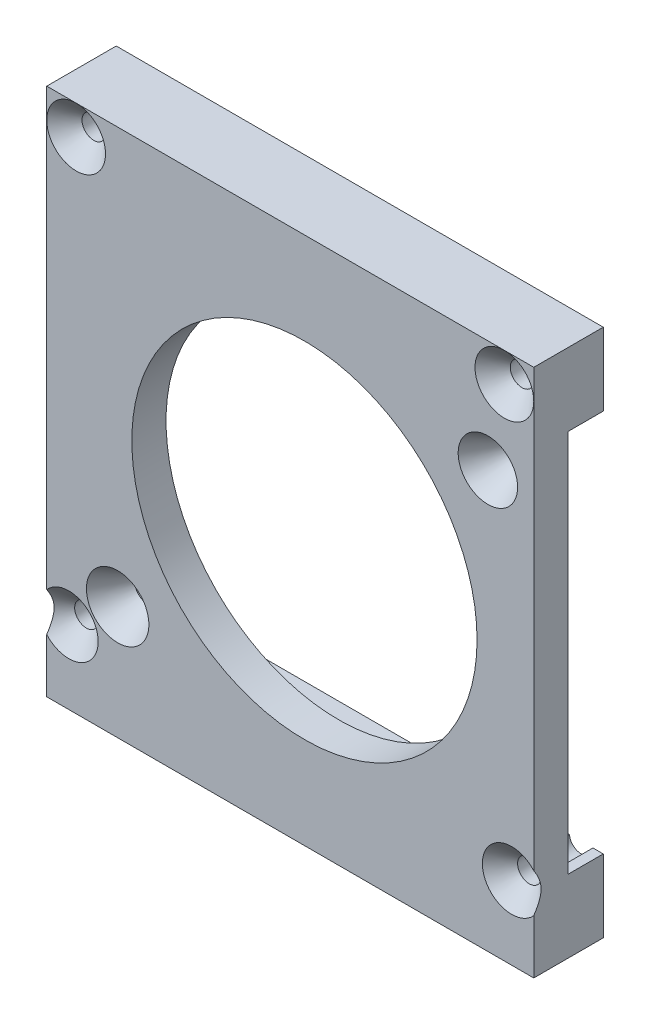
ISO-10303-21;
HEADER;
FILE_DESCRIPTION(('STEP AP214'),'2;1');
FILE_NAME('part.step','',(''),(''),'','','');
FILE_SCHEMA(('AUTOMOTIVE_DESIGN { 1 0 10303 214 1 1 1 1 }'));
ENDSEC;
DATA;
#1=APPLICATION_CONTEXT('core data for automotive mechanical design processes');
#2=APPLICATION_PROTOCOL_DEFINITION('international standard','automotive_design',2000,#1);
#3=PRODUCT_CONTEXT('',#1,'mechanical');
#4=PRODUCT('Part','Part','',(#3));
#5=PRODUCT_RELATED_PRODUCT_CATEGORY('part','',(#4));
#6=PRODUCT_DEFINITION_FORMATION('','',#4);
#7=PRODUCT_DEFINITION_CONTEXT('part definition',#1,'design');
#8=PRODUCT_DEFINITION('design','',#6,#7);
#9=PRODUCT_DEFINITION_SHAPE('','',#8);
#10=(LENGTH_UNIT() NAMED_UNIT(*) SI_UNIT(.MILLI.,.METRE.));
#11=(NAMED_UNIT(*) PLANE_ANGLE_UNIT() SI_UNIT($,.RADIAN.));
#12=(NAMED_UNIT(*) SI_UNIT($,.STERADIAN.) SOLID_ANGLE_UNIT());
#13=UNCERTAINTY_MEASURE_WITH_UNIT(LENGTH_MEASURE(1.E-05),#10,'distance_accuracy_value','');
#14=(GEOMETRIC_REPRESENTATION_CONTEXT(3) GLOBAL_UNCERTAINTY_ASSIGNED_CONTEXT((#13)) GLOBAL_UNIT_ASSIGNED_CONTEXT((#10,
#11,#12)) REPRESENTATION_CONTEXT('',''));
#15=CARTESIAN_POINT('',(0.,0.,0.));
#16=DIRECTION('',(0.,0.,1.));
#17=DIRECTION('',(1.,0.,0.));
#18=AXIS2_PLACEMENT_3D('',#15,#16,#17);
#19=CARTESIAN_POINT('',(0.,0.,4.73));
#20=DIRECTION('',(0.,0.,1.));
#21=DIRECTION('',(1.,0.,0.));
#22=AXIS2_PLACEMENT_3D('',#19,#20,#21);
#23=PLANE('',#22);
#24=DIRECTION('',(-1.,0.,0.));
#25=VECTOR('',#24,1.);
#26=CARTESIAN_POINT('',(0.,18.,4.73));
#27=LINE('',#26,#25);
#28=CARTESIAN_POINT('',(16.575,18.,4.73));
#29=VERTEX_POINT('',#28);
#30=CARTESIAN_POINT('',(14.575,18.,4.73));
#31=VERTEX_POINT('',#30);
#32=EDGE_CURVE('E355',#29,#31,#27,.T.);
#33=ORIENTED_EDGE('',*,*,#32,.T.);
#34=CARTESIAN_POINT('',(14.575,16.,4.73));
#35=DIRECTION('',(0.,0.,1.));
#36=DIRECTION('',(1.,0.,0.));
#37=AXIS2_PLACEMENT_3D('',#34,#35,#36);
#38=CIRCLE('',#37,1.99999999999999);
#39=CARTESIAN_POINT('',(16.575,16.,4.73));
#40=VERTEX_POINT('',#39);
#41=EDGE_CURVE('E242',#31,#40,#38,.F.);
#42=ORIENTED_EDGE('',*,*,#41,.T.);
#43=DIRECTION('',(0.,-1.,0.));
#44=VECTOR('',#43,1.);
#45=CARTESIAN_POINT('',(16.575,0.,4.73));
#46=LINE('',#45,#44);
#47=EDGE_CURVE('E344',#29,#40,#46,.T.);
#48=ORIENTED_EDGE('',*,*,#47,.F.);
#49=EDGE_LOOP('',(#33,#42,#48));
#50=FACE_BOUND('',#49,.T.);
#51=ADVANCED_FACE('F37',(#50),#23,.T.);
#52=DIRECTION('',(0.,-1.,0.));
#53=VECTOR('',#52,1.);
#54=CARTESIAN_POINT('',(-16.575,0.,4.73));
#55=LINE('',#54,#53);
#56=CARTESIAN_POINT('',(-16.575,18.,4.73));
#57=VERTEX_POINT('',#56);
#58=CARTESIAN_POINT('',(-16.575,16.,4.73));
#59=VERTEX_POINT('',#58);
#60=EDGE_CURVE('E326',#57,#59,#55,.T.);
#61=ORIENTED_EDGE('',*,*,#60,.T.);
#62=CARTESIAN_POINT('',(-14.575,16.,4.73));
#63=DIRECTION('',(0.,0.,1.));
#64=DIRECTION('',(1.,0.,0.));
#65=AXIS2_PLACEMENT_3D('',#62,#63,#64);
#66=CIRCLE('',#65,1.99999999999999);
#67=CARTESIAN_POINT('',(-14.575,18.,4.73));
#68=VERTEX_POINT('',#67);
#69=EDGE_CURVE('E237',#59,#68,#66,.F.);
#70=ORIENTED_EDGE('',*,*,#69,.T.);
#71=EDGE_CURVE('E352',#68,#57,#27,.T.);
#72=ORIENTED_EDGE('',*,*,#71,.T.);
#73=EDGE_LOOP('',(#61,#70,#72));
#74=FACE_BOUND('',#73,.T.);
#75=ADVANCED_FACE('F297',(#74),#23,.T.);
#76=CARTESIAN_POINT('',(-14.975,-13.05,2.4));
#77=DIRECTION('',(0.,-1.,0.));
#78=DIRECTION('',(0.,0.,-1.));
#79=AXIS2_PLACEMENT_3D('',#76,#77,#78);
#80=PLANE('',#79);
#81=DIRECTION('',(-1.,0.,0.));
#82=VECTOR('',#81,1.);
#83=CARTESIAN_POINT('',(-14.975,-13.05,0.));
#84=LINE('',#83,#82);
#85=CARTESIAN_POINT('',(16.575,-13.05,0.));
#86=VERTEX_POINT('',#85);
#87=CARTESIAN_POINT('',(15.8734359711336,-13.05,0.));
#88=VERTEX_POINT('',#87);
#89=EDGE_CURVE('E165',#86,#88,#84,.T.);
#90=ORIENTED_EDGE('',*,*,#89,.T.);
#91=DIRECTION('',(0.,0.,1.));
#92=VECTOR('',#91,1.);
#93=CARTESIAN_POINT('',(15.8734359711336,-13.05,-1.07));
#94=LINE('',#93,#92);
#95=CARTESIAN_POINT('',(15.8734359711336,-13.05,2.4));
#96=VERTEX_POINT('',#95);
#97=EDGE_CURVE('E147',#88,#96,#94,.T.);
#98=ORIENTED_EDGE('',*,*,#97,.T.);
#99=DIRECTION('',(-1.,0.,0.));
#100=VECTOR('',#99,1.);
#101=CARTESIAN_POINT('',(-14.975,-13.05,2.4));
#102=LINE('',#101,#100);
#103=CARTESIAN_POINT('',(16.575,-13.05,2.4));
#104=VERTEX_POINT('',#103);
#105=EDGE_CURVE('E162',#104,#96,#102,.T.);
#106=ORIENTED_EDGE('',*,*,#105,.F.);
#107=DIRECTION('',(0.,0.,-1.));
#108=VECTOR('',#107,1.);
#109=CARTESIAN_POINT('',(16.575,-13.05,2.4));
#110=LINE('',#109,#108);
#111=EDGE_CURVE('E206',#104,#86,#110,.T.);
#112=ORIENTED_EDGE('',*,*,#111,.T.);
#113=EDGE_LOOP('',(#90,#98,#106,#112));
#114=FACE_BOUND('',#113,.T.);
#115=ADVANCED_FACE('F160',(#114),#80,.F.);
#116=CARTESIAN_POINT('',(-16.575,18.,2.4));
#117=DIRECTION('',(0.,-1.,0.));
#118=DIRECTION('',(0.,0.,-1.));
#119=AXIS2_PLACEMENT_3D('',#116,#117,#118);
#120=PLANE('',#119);
#121=DIRECTION('',(-1.,0.,0.));
#122=VECTOR('',#121,1.);
#123=CARTESIAN_POINT('',(-16.575,18.,0.));
#124=LINE('',#123,#122);
#125=CARTESIAN_POINT('',(16.575,18.,0.));
#126=VERTEX_POINT('',#125);
#127=CARTESIAN_POINT('',(-16.575,18.,0.));
#128=VERTEX_POINT('',#127);
#129=EDGE_CURVE('E187',#126,#128,#124,.T.);
#130=ORIENTED_EDGE('',*,*,#129,.T.);
#131=DIRECTION('',(0.,0.,-1.));
#132=VECTOR('',#131,1.);
#133=CARTESIAN_POINT('',(-16.575,18.,2.4));
#134=LINE('',#133,#132);
#135=EDGE_CURVE('E214',#57,#128,#134,.T.);
#136=ORIENTED_EDGE('',*,*,#135,.F.);
#137=ORIENTED_EDGE('',*,*,#71,.F.);
#138=EDGE_CURVE('E354',#31,#68,#27,.T.);
#139=ORIENTED_EDGE('',*,*,#138,.F.);
#140=ORIENTED_EDGE('',*,*,#32,.F.);
#141=DIRECTION('',(0.,0.,-1.));
#142=VECTOR('',#141,1.);
#143=CARTESIAN_POINT('',(16.575,18.,2.4));
#144=LINE('',#143,#142);
#145=EDGE_CURVE('E217',#29,#126,#144,.T.);
#146=ORIENTED_EDGE('',*,*,#145,.T.);
#147=EDGE_LOOP('',(#130,#136,#137,#139,#140,#146));
#148=FACE_BOUND('',#147,.T.);
#149=ADVANCED_FACE('F270',(#148),#120,.F.);
#150=CARTESIAN_POINT('',(-16.575,-18.,2.4));
#151=DIRECTION('',(1.,0.,0.));
#152=DIRECTION('',(0.,0.,-1.));
#153=AXIS2_PLACEMENT_3D('',#150,#151,#152);
#154=PLANE('',#153);
#155=CARTESIAN_POINT('',(-16.575,-14.3228756555323,4.73));
#156=VERTEX_POINT('',#155);
#157=CARTESIAN_POINT('',(-16.575,-18.,4.73));
#158=VERTEX_POINT('',#157);
#159=EDGE_CURVE('E360',#156,#158,#55,.T.);
#160=ORIENTED_EDGE('',*,*,#159,.F.);
#161=CARTESIAN_POINT('',(-16.575,-14.3228756555323,4.73));
#162=CARTESIAN_POINT('',(-16.575,-14.290787229781,4.70877822540859));
#163=CARTESIAN_POINT('',(-16.575,-14.2585018253979,4.68785474539151));
#164=CARTESIAN_POINT('',(-16.575,-14.1934788787729,4.64670450337306));
#165=CARTESIAN_POINT('',(-16.575,-14.1607412223944,4.62647792192344));
#166=CARTESIAN_POINT('',(-16.575,-14.0614503224669,4.56680737780514));
#167=CARTESIAN_POINT('',(-16.575,-13.9941461585979,4.52859177689577));
#168=CARTESIAN_POINT('',(-16.575,-13.8551730032379,4.45560718416475));
#169=CARTESIAN_POINT('',(-16.575,-13.7834340794751,4.42096973962263));
#170=CARTESIAN_POINT('',(-16.575,-13.6371826194578,4.35839039909977));
#171=CARTESIAN_POINT('',(-16.575,-13.5626764398137,4.33043413675627));
#172=CARTESIAN_POINT('',(-16.575,-13.4422072500044,4.29325047900065));
#173=CARTESIAN_POINT('',(-16.575,-13.3971604193077,4.28105601309865));
#174=CARTESIAN_POINT('',(-16.575,-13.3062213293736,4.26029854037117));
#175=CARTESIAN_POINT('',(-16.575,-13.2603290439528,4.25173564621163));
#176=CARTESIAN_POINT('',(-16.575,-13.1685127918861,4.23876018560834));
#177=CARTESIAN_POINT('',(-16.575,-13.122595757367,4.23429924554022));
#178=CARTESIAN_POINT('',(-16.575,-13.0305457980283,4.22960693406729));
#179=CARTESIAN_POINT('',(-16.575,-12.9844128892929,4.22937525241618));
#180=CARTESIAN_POINT('',(-16.575,-12.8923019760753,4.23315688299962));
#181=CARTESIAN_POINT('',(-16.575,-12.8463240516254,4.23717212675656));
#182=CARTESIAN_POINT('',(-16.575,-12.754888453251,4.24921705200227));
#183=CARTESIAN_POINT('',(-16.575,-12.7094310478768,4.25724871795552));
#184=CARTESIAN_POINT('',(-16.575,-12.5732435968542,4.28699369897252));
#185=CARTESIAN_POINT('',(-16.575,-12.4837172370812,4.31430112654313));
#186=CARTESIAN_POINT('',(-16.575,-12.3316420737553,4.37105905079476));
#187=CARTESIAN_POINT('',(-16.575,-12.2681348742487,4.39810320785489));
#188=CARTESIAN_POINT('',(-16.575,-12.1431151051711,4.45661719834434));
#189=CARTESIAN_POINT('',(-16.575,-12.0816047446507,4.48809174056334));
#190=CARTESIAN_POINT('',(-16.575,-11.9620650293405,4.55342004798327));
#191=CARTESIAN_POINT('',(-16.575,-11.9039864843212,4.5871853410764));
#192=CARTESIAN_POINT('',(-16.575,-11.7894515544338,4.65702234705862));
#193=CARTESIAN_POINT('',(-16.575,-11.7329910576854,4.69308728877047));
#194=CARTESIAN_POINT('',(-16.575,-11.6771243444677,4.73));
#195=B_SPLINE_CURVE_WITH_KNOTS('',3,(#161,#162,#163,#164,#165,#166,#167,#168,#169,#170,#171,
#172,#173,#174,#175,#176,#177,#178,#179,#180,#181,#182,#183,#184,#185,#186,#187,#188,#189,#190,
#191,#192,#193,#194),.UNSPECIFIED.,.F.,.F.,(4,2,2,2,2,2,2,2,2,2,2,2,2,2,2,2,4),(0.,
0.115409990160205,0.230849659161227,0.462908892991754,0.701675550602009,0.939924079945642,
1.07980439246438,1.21968904431463,1.35790207419027,1.49610496511246,1.63437073842211,
1.77270489473647,2.05239562559207,2.25931271179453,2.46645140198266,2.66793208946148,
2.86884471773802),.UNSPECIFIED.);
#196=CARTESIAN_POINT('',(-16.575,-11.6771243444677,4.73));
#197=VERTEX_POINT('',#196);
#198=EDGE_CURVE('E52',#156,#197,#195,.T.);
#199=ORIENTED_EDGE('',*,*,#198,.T.);
#200=EDGE_CURVE('E319',#59,#197,#55,.T.);
#201=ORIENTED_EDGE('',*,*,#200,.F.);
#202=ORIENTED_EDGE('',*,*,#60,.F.);
#203=ORIENTED_EDGE('',*,*,#135,.T.);
#204=DIRECTION('',(0.,-1.,0.));
#205=VECTOR('',#204,1.);
#206=CARTESIAN_POINT('',(-16.575,-18.,0.));
#207=LINE('',#206,#205);
#208=CARTESIAN_POINT('',(-16.575,-18.,0.));
#209=VERTEX_POINT('',#208);
#210=EDGE_CURVE('E190',#128,#209,#207,.T.);
#211=ORIENTED_EDGE('',*,*,#210,.T.);
#212=DIRECTION('',(0.,0.,-1.));
#213=VECTOR('',#212,1.);
#214=CARTESIAN_POINT('',(-16.575,-18.,2.4));
#215=LINE('',#214,#213);
#216=EDGE_CURVE('E211',#158,#209,#215,.T.);
#217=ORIENTED_EDGE('',*,*,#216,.F.);
#218=EDGE_LOOP('',(#160,#199,#201,#202,#203,#211,#217));
#219=FACE_BOUND('',#218,.T.);
#220=ADVANCED_FACE('F264',(#219),#154,.F.);
#221=CARTESIAN_POINT('',(-16.575,-18.,2.4));
#222=DIRECTION('',(0.,1.,0.));
#223=DIRECTION('',(0.,0.,1.));
#224=AXIS2_PLACEMENT_3D('',#221,#222,#223);
#225=PLANE('',#224);
#226=DIRECTION('',(1.,0.,0.));
#227=VECTOR('',#226,1.);
#228=CARTESIAN_POINT('',(-16.575,-18.,0.));
#229=LINE('',#228,#227);
#230=CARTESIAN_POINT('',(16.575,-18.,0.));
#231=VERTEX_POINT('',#230);
#232=EDGE_CURVE('E192',#209,#231,#229,.T.);
#233=ORIENTED_EDGE('',*,*,#232,.T.);
#234=DIRECTION('',(0.,0.,-1.));
#235=VECTOR('',#234,1.);
#236=CARTESIAN_POINT('',(16.575,-18.,2.4));
#237=LINE('',#236,#235);
#238=CARTESIAN_POINT('',(16.575,-18.,4.73));
#239=VERTEX_POINT('',#238);
#240=EDGE_CURVE('E208',#239,#231,#237,.T.);
#241=ORIENTED_EDGE('',*,*,#240,.F.);
#242=DIRECTION('',(1.,0.,0.));
#243=VECTOR('',#242,1.);
#244=CARTESIAN_POINT('',(0.,-18.,4.73));
#245=LINE('',#244,#243);
#246=EDGE_CURVE('E323',#158,#239,#245,.T.);
#247=ORIENTED_EDGE('',*,*,#246,.F.);
#248=ORIENTED_EDGE('',*,*,#216,.T.);
#249=EDGE_LOOP('',(#233,#241,#247,#248));
#250=FACE_BOUND('',#249,.T.);
#251=ADVANCED_FACE('F269',(#250),#225,.F.);
#252=CARTESIAN_POINT('',(16.575,-18.,2.4));
#253=DIRECTION('',(-1.,0.,0.));
#254=DIRECTION('',(0.,0.,1.));
#255=AXIS2_PLACEMENT_3D('',#252,#253,#254);
#256=PLANE('',#255);
#257=CARTESIAN_POINT('',(16.575,-11.6771243444677,4.73));
#258=VERTEX_POINT('',#257);
#259=EDGE_CURVE('E342',#40,#258,#46,.T.);
#260=ORIENTED_EDGE('',*,*,#259,.T.);
#261=CARTESIAN_POINT('',(16.575,-11.6771243444677,4.73));
#262=CARTESIAN_POINT('',(16.575,-11.709212770219,4.70877822540859));
#263=CARTESIAN_POINT('',(16.575,-11.7414981746021,4.68785474539151));
#264=CARTESIAN_POINT('',(16.575,-11.8065211212271,4.64670450337306));
#265=CARTESIAN_POINT('',(16.575,-11.8392587776056,4.62647792192344));
#266=CARTESIAN_POINT('',(16.575,-11.9385496775331,4.56680737780514));
#267=CARTESIAN_POINT('',(16.575,-12.0058538414021,4.52859177689577));
#268=CARTESIAN_POINT('',(16.575,-12.1448269967621,4.45560718416475));
#269=CARTESIAN_POINT('',(16.575,-12.2165659205249,4.42096973962263));
#270=CARTESIAN_POINT('',(16.575,-12.3628173805422,4.35839039909977));
#271=CARTESIAN_POINT('',(16.575,-12.4373235601863,4.33043413675627));
#272=CARTESIAN_POINT('',(16.575,-12.5577927499956,4.29325047900065));
#273=CARTESIAN_POINT('',(16.575,-12.6028395806923,4.28105601309865));
#274=CARTESIAN_POINT('',(16.575,-12.6937786706264,4.26029854037117));
#275=CARTESIAN_POINT('',(16.575,-12.7396709560472,4.25173564621163));
#276=CARTESIAN_POINT('',(16.575,-12.8314872081139,4.23876018560834));
#277=CARTESIAN_POINT('',(16.575,-12.877404242633,4.23429924554022));
#278=CARTESIAN_POINT('',(16.575,-12.9694542019717,4.22960693406729));
#279=CARTESIAN_POINT('',(16.575,-13.0155871107071,4.22937525241618));
#280=CARTESIAN_POINT('',(16.575,-13.1076980239247,4.23315688299962));
#281=CARTESIAN_POINT('',(16.575,-13.1536759483746,4.23717212675656));
#282=CARTESIAN_POINT('',(16.575,-13.245111546749,4.24921705200227));
#283=CARTESIAN_POINT('',(16.575,-13.2905689521232,4.25724871795552));
#284=CARTESIAN_POINT('',(16.575,-13.4267564031458,4.28699369897252));
#285=CARTESIAN_POINT('',(16.575,-13.5162827629188,4.31430112654313));
#286=CARTESIAN_POINT('',(16.575,-13.6683579262447,4.37105905079476));
#287=CARTESIAN_POINT('',(16.575,-13.7318651257513,4.39810320785489));
#288=CARTESIAN_POINT('',(16.575,-13.8568848948289,4.45661719834434));
#289=CARTESIAN_POINT('',(16.575,-13.9183952553493,4.48809174056334));
#290=CARTESIAN_POINT('',(16.575,-14.0379349706595,4.55342004798327));
#291=CARTESIAN_POINT('',(16.575,-14.0960135156788,4.5871853410764));
#292=CARTESIAN_POINT('',(16.575,-14.2105484455662,4.65702234705862));
#293=CARTESIAN_POINT('',(16.575,-14.2670089423146,4.69308728877047));
#294=CARTESIAN_POINT('',(16.575,-14.3228756555323,4.73));
#295=B_SPLINE_CURVE_WITH_KNOTS('',3,(#261,#262,#263,#264,#265,#266,#267,#268,#269,#270,#271,
#272,#273,#274,#275,#276,#277,#278,#279,#280,#281,#282,#283,#284,#285,#286,#287,#288,#289,#290,
#291,#292,#293,#294),.UNSPECIFIED.,.F.,.F.,(4,2,2,2,2,2,2,2,2,2,2,2,2,2,2,2,4),(0.,
0.115409990160205,0.230849659161227,0.462908892991752,0.701675550602005,0.939924079945642,
1.07980439246438,1.21968904431463,1.35790207419027,1.49610496511246,1.63437073842211,
1.77270489473647,2.05239562559207,2.25931271179453,2.46645140198266,2.66793208946148,
2.86884471773802),.UNSPECIFIED.);
#296=CARTESIAN_POINT('',(16.575,-14.3228756555323,4.73));
#297=VERTEX_POINT('',#296);
#298=EDGE_CURVE('E378',#258,#297,#295,.T.);
#299=ORIENTED_EDGE('',*,*,#298,.T.);
#300=EDGE_CURVE('E339',#297,#239,#46,.T.);
#301=ORIENTED_EDGE('',*,*,#300,.T.);
#302=ORIENTED_EDGE('',*,*,#240,.T.);
#303=DIRECTION('',(0.,1.,0.));
#304=VECTOR('',#303,1.);
#305=CARTESIAN_POINT('',(16.575,-18.,0.));
#306=LINE('',#305,#304);
#307=EDGE_CURVE('E194',#231,#86,#306,.T.);
#308=ORIENTED_EDGE('',*,*,#307,.T.);
#309=ORIENTED_EDGE('',*,*,#111,.F.);
#310=DIRECTION('',(0.,-1.,0.));
#311=VECTOR('',#310,1.);
#312=CARTESIAN_POINT('',(16.575,0.,2.4));
#313=LINE('',#312,#311);
#314=CARTESIAN_POINT('',(16.575,13.05,2.4));
#315=VERTEX_POINT('',#314);
#316=EDGE_CURVE('E171',#315,#104,#313,.T.);
#317=ORIENTED_EDGE('',*,*,#316,.F.);
#318=DIRECTION('',(0.,0.,-1.));
#319=VECTOR('',#318,1.);
#320=CARTESIAN_POINT('',(16.575,13.05,2.4));
#321=LINE('',#320,#319);
#322=CARTESIAN_POINT('',(16.575,13.05,0.));
#323=VERTEX_POINT('',#322);
#324=EDGE_CURVE('E183',#315,#323,#321,.T.);
#325=ORIENTED_EDGE('',*,*,#324,.T.);
#326=DIRECTION('',(0.,1.,0.));
#327=VECTOR('',#326,1.);
#328=CARTESIAN_POINT('',(16.575,13.05,0.));
#329=LINE('',#328,#327);
#330=EDGE_CURVE('E184',#323,#126,#329,.T.);
#331=ORIENTED_EDGE('',*,*,#330,.T.);
#332=ORIENTED_EDGE('',*,*,#145,.F.);
#333=ORIENTED_EDGE('',*,*,#47,.T.);
#334=EDGE_LOOP('',(#260,#299,#301,#302,#308,#309,#317,#325,#331,#332,#333));
#335=FACE_BOUND('',#334,.T.);
#336=ADVANCED_FACE('F387',(#335),#256,.F.);
#337=CARTESIAN_POINT('',(14.2765640288664,-13.05,0.));
#338=VERTEX_POINT('',#337);
#339=CARTESIAN_POINT('',(-14.2765640288664,-13.05,0.));
#340=VERTEX_POINT('',#339);
#341=EDGE_CURVE('E196',#338,#340,#84,.T.);
#342=ORIENTED_EDGE('',*,*,#341,.T.);
#343=DIRECTION('',(0.,0.,1.));
#344=VECTOR('',#343,1.);
#345=CARTESIAN_POINT('',(-14.2765640288664,-13.05,-1.07));
#346=LINE('',#345,#344);
#347=CARTESIAN_POINT('',(-14.2765640288664,-13.05,2.4));
#348=VERTEX_POINT('',#347);
#349=EDGE_CURVE('E616',#340,#348,#346,.T.);
#350=ORIENTED_EDGE('',*,*,#349,.T.);
#351=CARTESIAN_POINT('',(14.2765640288664,-13.05,2.4));
#352=VERTEX_POINT('',#351);
#353=EDGE_CURVE('E173',#352,#348,#102,.T.);
#354=ORIENTED_EDGE('',*,*,#353,.F.);
#355=DIRECTION('',(0.,0.,1.));
#356=VECTOR('',#355,1.);
#357=CARTESIAN_POINT('',(14.2765640288664,-13.05,-1.07));
#358=LINE('',#357,#356);
#359=EDGE_CURVE('E150',#352,#338,#358,.F.);
#360=ORIENTED_EDGE('',*,*,#359,.T.);
#361=EDGE_LOOP('',(#342,#350,#354,#360));
#362=FACE_BOUND('',#361,.T.);
#363=ADVANCED_FACE('F391',(#362),#80,.F.);
#364=CARTESIAN_POINT('',(-14.975,-13.05,2.4));
#365=DIRECTION('',(-1.,0.,0.));
#366=DIRECTION('',(0.,0.,1.));
#367=AXIS2_PLACEMENT_3D('',#364,#365,#366);
#368=PLANE('',#367);
#369=DIRECTION('',(0.,1.,0.));
#370=VECTOR('',#369,1.);
#371=CARTESIAN_POINT('',(-14.975,-13.05,2.4));
#372=LINE('',#371,#370);
#373=CARTESIAN_POINT('',(-14.975,-12.2062746066806,2.4));
#374=VERTEX_POINT('',#373);
#375=CARTESIAN_POINT('',(-14.975,13.05,2.4));
#376=VERTEX_POINT('',#375);
#377=EDGE_CURVE('E172',#374,#376,#372,.T.);
#378=ORIENTED_EDGE('',*,*,#377,.F.);
#379=DIRECTION('',(0.,0.,1.));
#380=VECTOR('',#379,1.);
#381=CARTESIAN_POINT('',(-14.975,-12.2062746066806,-1.07));
#382=LINE('',#381,#380);
#383=CARTESIAN_POINT('',(-14.975,-12.2062746066806,0.));
#384=VERTEX_POINT('',#383);
#385=EDGE_CURVE('E621',#374,#384,#382,.F.);
#386=ORIENTED_EDGE('',*,*,#385,.T.);
#387=DIRECTION('',(0.,1.,0.));
#388=VECTOR('',#387,1.);
#389=CARTESIAN_POINT('',(-14.975,-13.05,0.));
#390=LINE('',#389,#388);
#391=CARTESIAN_POINT('',(-14.975,13.05,0.));
#392=VERTEX_POINT('',#391);
#393=EDGE_CURVE('E198',#384,#392,#390,.T.);
#394=ORIENTED_EDGE('',*,*,#393,.T.);
#395=DIRECTION('',(0.,0.,-1.));
#396=VECTOR('',#395,1.);
#397=CARTESIAN_POINT('',(-14.975,13.05,2.4));
#398=LINE('',#397,#396);
#399=EDGE_CURVE('E203',#376,#392,#398,.T.);
#400=ORIENTED_EDGE('',*,*,#399,.F.);
#401=EDGE_LOOP('',(#378,#386,#394,#400));
#402=FACE_BOUND('',#401,.T.);
#403=ADVANCED_FACE('F394',(#402),#368,.F.);
#404=CARTESIAN_POINT('',(-14.975,13.05,2.4));
#405=DIRECTION('',(0.,1.,0.));
#406=DIRECTION('',(0.,0.,1.));
#407=AXIS2_PLACEMENT_3D('',#404,#405,#406);
#408=PLANE('',#407);
#409=DIRECTION('',(1.,0.,0.));
#410=VECTOR('',#409,1.);
#411=CARTESIAN_POINT('',(-14.975,13.05,0.));
#412=LINE('',#411,#410);
#413=EDGE_CURVE('E177',#392,#323,#412,.T.);
#414=ORIENTED_EDGE('',*,*,#413,.T.);
#415=ORIENTED_EDGE('',*,*,#324,.F.);
#416=DIRECTION('',(1.,0.,0.));
#417=VECTOR('',#416,1.);
#418=CARTESIAN_POINT('',(-14.975,13.05,2.4));
#419=LINE('',#418,#417);
#420=EDGE_CURVE('E175',#376,#315,#419,.T.);
#421=ORIENTED_EDGE('',*,*,#420,.F.);
#422=ORIENTED_EDGE('',*,*,#399,.T.);
#423=EDGE_LOOP('',(#414,#415,#421,#422));
#424=FACE_BOUND('',#423,.T.);
#425=ADVANCED_FACE('F398',(#424),#408,.F.);
#426=CARTESIAN_POINT('',(0.,0.,0.));
#427=DIRECTION('',(0.,0.,-1.));
#428=DIRECTION('',(-1.,0.,0.));
#429=AXIS2_PLACEMENT_3D('',#426,#427,#428);
#430=PLANE('',#429);
#431=CARTESIAN_POINT('',(14.575,16.,0.));
#432=DIRECTION('',(0.,0.,-1.));
#433=DIRECTION('',(-1.,0.,0.));
#434=AXIS2_PLACEMENT_3D('',#431,#432,#433);
#435=CIRCLE('',#434,0.8);
#436=CARTESIAN_POINT('',(13.775,16.,0.));
#437=VERTEX_POINT('',#436);
#438=EDGE_CURVE('E332',#437,#437,#435,.T.);
#439=ORIENTED_EDGE('',*,*,#438,.F.);
#440=EDGE_LOOP('',(#439));
#441=FACE_BOUND('',#440,.T.);
#442=CARTESIAN_POINT('',(-15.075,-13.,0.));
#443=DIRECTION('',(0.,0.,-1.));
#444=DIRECTION('',(-1.,0.,0.));
#445=AXIS2_PLACEMENT_3D('',#442,#443,#444);
#446=CIRCLE('',#445,0.800000000000001);
#447=EDGE_CURVE('E615',#340,#384,#446,.T.);
#448=ORIENTED_EDGE('',*,*,#447,.F.);
#449=ORIENTED_EDGE('',*,*,#341,.F.);
#450=CARTESIAN_POINT('',(15.075,-13.,0.));
#451=DIRECTION('',(0.,0.,-1.));
#452=DIRECTION('',(-1.,0.,0.));
#453=AXIS2_PLACEMENT_3D('',#450,#451,#452);
#454=CIRCLE('',#453,0.800000000000001);
#455=EDGE_CURVE('E166',#88,#338,#454,.T.);
#456=ORIENTED_EDGE('',*,*,#455,.F.);
#457=ORIENTED_EDGE('',*,*,#89,.F.);
#458=ORIENTED_EDGE('',*,*,#307,.F.);
#459=ORIENTED_EDGE('',*,*,#232,.F.);
#460=ORIENTED_EDGE('',*,*,#210,.F.);
#461=ORIENTED_EDGE('',*,*,#129,.F.);
#462=ORIENTED_EDGE('',*,*,#330,.F.);
#463=ORIENTED_EDGE('',*,*,#413,.F.);
#464=ORIENTED_EDGE('',*,*,#393,.F.);
#465=EDGE_LOOP('',(#448,#449,#456,#457,#458,#459,#460,#461,#462,#463,#464));
#466=FACE_BOUND('',#465,.T.);
#467=CARTESIAN_POINT('',(-14.575,16.,0.));
#468=DIRECTION('',(0.,0.,-1.));
#469=DIRECTION('',(-1.,0.,0.));
#470=AXIS2_PLACEMENT_3D('',#467,#468,#469);
#471=CIRCLE('',#470,0.8);
#472=CARTESIAN_POINT('',(-15.375,16.,0.));
#473=VERTEX_POINT('',#472);
#474=EDGE_CURVE('E155',#473,#473,#471,.T.);
#475=ORIENTED_EDGE('',*,*,#474,.F.);
#476=EDGE_LOOP('',(#475));
#477=FACE_BOUND('',#476,.T.);
#478=ADVANCED_FACE('F402',(#441,#466,#477),#430,.T.);
#479=CARTESIAN_POINT('',(0.,0.,2.4));
#480=DIRECTION('',(0.,0.,1.));
#481=DIRECTION('',(1.,0.,0.));
#482=AXIS2_PLACEMENT_3D('',#479,#480,#481);
#483=PLANE('',#482);
#484=CARTESIAN_POINT('',(13.452978113297,10.377978113297,2.4));
#485=DIRECTION('',(0.,0.,1.));
#486=DIRECTION('',(1.,0.,0.));
#487=AXIS2_PLACEMENT_3D('',#484,#485,#486);
#488=CIRCLE('',#487,0.822021886702976);
#489=CARTESIAN_POINT('',(14.275,10.377978113297,2.4));
#490=VERTEX_POINT('',#489);
#491=EDGE_CURVE('E331',#490,#490,#488,.T.);
#492=ORIENTED_EDGE('',*,*,#491,.T.);
#493=EDGE_LOOP('',(#492));
#494=FACE_BOUND('',#493,.T.);
#495=CARTESIAN_POINT('',(0.965000000000001,0.,2.4));
#496=DIRECTION('',(0.,0.,1.));
#497=DIRECTION('',(1.,0.,0.));
#498=AXIS2_PLACEMENT_3D('',#495,#496,#497);
#499=CIRCLE('',#498,11.75);
#500=CARTESIAN_POINT('',(12.715,0.,2.4));
#501=VERTEX_POINT('',#500);
#502=EDGE_CURVE('E334',#501,#501,#499,.T.);
#503=ORIENTED_EDGE('',*,*,#502,.T.);
#504=EDGE_LOOP('',(#503));
#505=FACE_BOUND('',#504,.T.);
#506=CARTESIAN_POINT('',(-11.7478914585298,-10.2728914585298,2.4));
#507=DIRECTION('',(0.,0.,1.));
#508=DIRECTION('',(1.,0.,0.));
#509=AXIS2_PLACEMENT_3D('',#506,#507,#508);
#510=CIRCLE('',#509,0.927108541470152);
#511=CARTESIAN_POINT('',(-10.8207829170597,-10.2728914585298,2.4));
#512=VERTEX_POINT('',#511);
#513=EDGE_CURVE('E179',#512,#512,#510,.T.);
#514=ORIENTED_EDGE('',*,*,#513,.T.);
#515=EDGE_LOOP('',(#514));
#516=FACE_BOUND('',#515,.T.);
#517=ORIENTED_EDGE('',*,*,#353,.T.);
#518=CARTESIAN_POINT('',(-15.075,-13.,2.4));
#519=DIRECTION('',(0.,0.,1.));
#520=DIRECTION('',(1.,0.,0.));
#521=AXIS2_PLACEMENT_3D('',#518,#519,#520);
#522=CIRCLE('',#521,0.800000000000001);
#523=EDGE_CURVE('E624',#348,#374,#522,.T.);
#524=ORIENTED_EDGE('',*,*,#523,.T.);
#525=ORIENTED_EDGE('',*,*,#377,.T.);
#526=ORIENTED_EDGE('',*,*,#420,.T.);
#527=ORIENTED_EDGE('',*,*,#316,.T.);
#528=ORIENTED_EDGE('',*,*,#105,.T.);
#529=CARTESIAN_POINT('',(15.075,-13.,2.4));
#530=DIRECTION('',(0.,0.,1.));
#531=DIRECTION('',(1.,0.,0.));
#532=AXIS2_PLACEMENT_3D('',#529,#530,#531);
#533=CIRCLE('',#532,0.800000000000001);
#534=EDGE_CURVE('E144',#96,#352,#533,.T.);
#535=ORIENTED_EDGE('',*,*,#534,.T.);
#536=EDGE_LOOP('',(#517,#524,#525,#526,#527,#528,#535));
#537=FACE_BOUND('',#536,.T.);
#538=ADVANCED_FACE('F168',(#494,#505,#516,#537),#483,.F.);
#539=CARTESIAN_POINT('',(0.965000000000001,0.,4.73));
#540=DIRECTION('',(0.,0.,-1.));
#541=DIRECTION('',(-1.,0.,0.));
#542=AXIS2_PLACEMENT_3D('',#539,#540,#541);
#543=CYLINDRICAL_SURFACE('',#542,11.75);
#544=CARTESIAN_POINT('',(0.965000000000001,0.,4.73));
#545=DIRECTION('',(0.,0.,1.));
#546=DIRECTION('',(1.,0.,0.));
#547=AXIS2_PLACEMENT_3D('',#544,#545,#546);
#548=CIRCLE('',#547,11.75);
#549=CARTESIAN_POINT('',(12.715,0.,4.73));
#550=VERTEX_POINT('',#549);
#551=EDGE_CURVE('E188',#550,#550,#548,.T.);
#552=ORIENTED_EDGE('',*,*,#551,.T.);
#553=EDGE_LOOP('',(#552));
#554=FACE_BOUND('',#553,.T.);
#555=ORIENTED_EDGE('',*,*,#502,.F.);
#556=EDGE_LOOP('',(#555));
#557=FACE_BOUND('',#556,.T.);
#558=ADVANCED_FACE('F409',(#554,#557),#543,.F.);
#559=CARTESIAN_POINT('',(13.452978113297,10.377978113297,4.73));
#560=DIRECTION('',(0.,0.,-1.));
#561=DIRECTION('',(-1.,0.,0.));
#562=AXIS2_PLACEMENT_3D('',#559,#560,#561);
#563=CYLINDRICAL_SURFACE('',#562,0.822021886702976);
#564=CARTESIAN_POINT('',(13.452978113297,10.377978113297,2.65153903091734));
#565=DIRECTION('',(0.,0.,1.));
#566=DIRECTION('',(1.,0.,0.));
#567=AXIS2_PLACEMENT_3D('',#564,#565,#566);
#568=CIRCLE('',#567,0.822021886702976);
#569=CARTESIAN_POINT('',(14.275,10.377978113297,2.65153903091734));
#570=VERTEX_POINT('',#569);
#571=EDGE_CURVE('E229',#570,#570,#568,.T.);
#572=ORIENTED_EDGE('',*,*,#571,.T.);
#573=EDGE_LOOP('',(#572));
#574=FACE_BOUND('',#573,.T.);
#575=ORIENTED_EDGE('',*,*,#491,.F.);
#576=EDGE_LOOP('',(#575));
#577=FACE_BOUND('',#576,.T.);
#578=ADVANCED_FACE('F312',(#574,#577),#563,.F.);
#579=CARTESIAN_POINT('',(-11.7478914585298,-10.2728914585298,4.73));
#580=DIRECTION('',(0.,0.,-1.));
#581=DIRECTION('',(-1.,0.,0.));
#582=AXIS2_PLACEMENT_3D('',#579,#580,#581);
#583=CYLINDRICAL_SURFACE('',#582,0.927108541470152);
#584=CARTESIAN_POINT('',(-11.7478914585298,-10.2728914585298,2.65153903091735));
#585=DIRECTION('',(0.,0.,1.));
#586=DIRECTION('',(1.,0.,0.));
#587=AXIS2_PLACEMENT_3D('',#584,#585,#586);
#588=CIRCLE('',#587,0.927108541470152);
#589=CARTESIAN_POINT('',(-10.8207829170597,-10.2728914585298,2.65153903091735));
#590=VERTEX_POINT('',#589);
#591=EDGE_CURVE('E220',#590,#590,#588,.T.);
#592=ORIENTED_EDGE('',*,*,#591,.T.);
#593=EDGE_LOOP('',(#592));
#594=FACE_BOUND('',#593,.T.);
#595=ORIENTED_EDGE('',*,*,#513,.F.);
#596=EDGE_LOOP('',(#595));
#597=FACE_BOUND('',#596,.T.);
#598=ADVANCED_FACE('F307',(#594,#597),#583,.F.);
#599=CARTESIAN_POINT('',(-11.7478914585298,-10.2728914585298,4.73));
#600=DIRECTION('',(0.,0.,1.));
#601=DIRECTION('',(1.,0.,0.));
#602=AXIS2_PLACEMENT_3D('',#599,#600,#601);
#603=CIRCLE('',#602,2.12710854147015);
#604=CARTESIAN_POINT('',(-9.62078291705969,-10.2728914585298,4.73));
#605=VERTEX_POINT('',#604);
#606=EDGE_CURVE('E226',#605,#605,#603,.F.);
#607=ORIENTED_EDGE('',*,*,#606,.T.);
#608=EDGE_LOOP('',(#607));
#609=FACE_BOUND('',#608,.T.);
#610=CARTESIAN_POINT('',(13.452978113297,10.377978113297,4.73));
#611=DIRECTION('',(0.,0.,1.));
#612=DIRECTION('',(1.,0.,0.));
#613=AXIS2_PLACEMENT_3D('',#610,#611,#612);
#614=CIRCLE('',#613,2.02202188670298);
#615=CARTESIAN_POINT('',(15.475,10.377978113297,4.73));
#616=VERTEX_POINT('',#615);
#617=EDGE_CURVE('E223',#616,#616,#614,.F.);
#618=ORIENTED_EDGE('',*,*,#617,.T.);
#619=EDGE_LOOP('',(#618));
#620=FACE_BOUND('',#619,.T.);
#621=ORIENTED_EDGE('',*,*,#200,.T.);
#622=CARTESIAN_POINT('',(-15.075,-13.,4.73));
#623=DIRECTION('',(0.,0.,1.));
#624=DIRECTION('',(1.,0.,0.));
#625=AXIS2_PLACEMENT_3D('',#622,#623,#624);
#626=CIRCLE('',#625,2.00000000000001);
#627=EDGE_CURVE('E248',#197,#156,#626,.F.);
#628=ORIENTED_EDGE('',*,*,#627,.T.);
#629=ORIENTED_EDGE('',*,*,#159,.T.);
#630=ORIENTED_EDGE('',*,*,#246,.T.);
#631=ORIENTED_EDGE('',*,*,#300,.F.);
#632=CARTESIAN_POINT('',(15.075,-13.,4.73));
#633=DIRECTION('',(0.,0.,1.));
#634=DIRECTION('',(1.,0.,0.));
#635=AXIS2_PLACEMENT_3D('',#632,#633,#634);
#636=CIRCLE('',#635,2.00000000000001);
#637=EDGE_CURVE('E245',#297,#258,#636,.F.);
#638=ORIENTED_EDGE('',*,*,#637,.T.);
#639=ORIENTED_EDGE('',*,*,#259,.F.);
#640=CARTESIAN_POINT('',(14.575,16.,4.73));
#641=DIRECTION('',(0.,0.,1.));
#642=DIRECTION('',(1.,0.,0.));
#643=AXIS2_PLACEMENT_3D('',#640,#641,#642);
#644=CIRCLE('',#643,1.99999999999999);
#645=EDGE_CURVE('E240',#40,#31,#644,.F.);
#646=ORIENTED_EDGE('',*,*,#645,.T.);
#647=ORIENTED_EDGE('',*,*,#138,.T.);
#648=CARTESIAN_POINT('',(-14.575,16.,4.73));
#649=DIRECTION('',(0.,0.,1.));
#650=DIRECTION('',(1.,0.,0.));
#651=AXIS2_PLACEMENT_3D('',#648,#649,#650);
#652=CIRCLE('',#651,1.99999999999999);
#653=EDGE_CURVE('E235',#68,#59,#652,.F.);
#654=ORIENTED_EDGE('',*,*,#653,.T.);
#655=EDGE_LOOP('',(#621,#628,#629,#630,#631,#638,#639,#646,#647,#654));
#656=FACE_BOUND('',#655,.T.);
#657=ORIENTED_EDGE('',*,*,#551,.F.);
#658=EDGE_LOOP('',(#657));
#659=FACE_BOUND('',#658,.T.);
#660=ADVANCED_FACE('F282',(#609,#620,#656,#659),#23,.T.);
#661=CARTESIAN_POINT('',(-11.7478914585298,-10.2728914585298,2.65153903091735));
#662=DIRECTION('',(0.,0.,1.));
#663=DIRECTION('',(1.,0.,0.));
#664=AXIS2_PLACEMENT_3D('',#661,#662,#663);
#665=CONICAL_SURFACE('',#664,0.927108541470152,0.5235987755983);
#666=ORIENTED_EDGE('',*,*,#606,.F.);
#667=EDGE_LOOP('',(#666));
#668=FACE_BOUND('',#667,.T.);
#669=ORIENTED_EDGE('',*,*,#591,.F.);
#670=EDGE_LOOP('',(#669));
#671=FACE_BOUND('',#670,.T.);
#672=ADVANCED_FACE('F276',(#668,#671),#665,.F.);
#673=CARTESIAN_POINT('',(13.452978113297,10.377978113297,2.65153903091734));
#674=DIRECTION('',(0.,0.,1.));
#675=DIRECTION('',(1.,0.,0.));
#676=AXIS2_PLACEMENT_3D('',#673,#674,#675);
#677=CONICAL_SURFACE('',#676,0.822021886702976,0.5235987755983);
#678=ORIENTED_EDGE('',*,*,#617,.F.);
#679=EDGE_LOOP('',(#678));
#680=FACE_BOUND('',#679,.T.);
#681=ORIENTED_EDGE('',*,*,#571,.F.);
#682=EDGE_LOOP('',(#681));
#683=FACE_BOUND('',#682,.T.);
#684=ADVANCED_FACE('F281',(#680,#683),#677,.F.);
#685=CARTESIAN_POINT('',(-14.575,16.,-1.07));
#686=DIRECTION('',(0.,0.,1.));
#687=DIRECTION('',(1.,0.,0.));
#688=AXIS2_PLACEMENT_3D('',#685,#686,#687);
#689=CYLINDRICAL_SURFACE('',#688,0.8);
#690=CARTESIAN_POINT('',(-14.575,16.,3.53000000000001));
#691=DIRECTION('',(0.,0.,1.));
#692=DIRECTION('',(1.,0.,0.));
#693=AXIS2_PLACEMENT_3D('',#690,#691,#692);
#694=CIRCLE('',#693,0.8);
#695=CARTESIAN_POINT('',(-13.775,16.,3.53000000000001));
#696=VERTEX_POINT('',#695);
#697=EDGE_CURVE('E11',#696,#696,#694,.T.);
#698=ORIENTED_EDGE('',*,*,#697,.T.);
#699=EDGE_LOOP('',(#698));
#700=FACE_BOUND('',#699,.T.);
#701=ORIENTED_EDGE('',*,*,#474,.T.);
#702=EDGE_LOOP('',(#701));
#703=FACE_BOUND('',#702,.T.);
#704=ADVANCED_FACE('F287',(#700,#703),#689,.F.);
#705=CARTESIAN_POINT('',(15.075,-13.,-1.07));
#706=DIRECTION('',(0.,0.,1.));
#707=DIRECTION('',(1.,0.,0.));
#708=AXIS2_PLACEMENT_3D('',#705,#706,#707);
#709=CYLINDRICAL_SURFACE('',#708,0.800000000000001);
#710=CARTESIAN_POINT('',(15.075,-13.,3.52999999999998));
#711=DIRECTION('',(0.,0.,1.));
#712=DIRECTION('',(1.,0.,0.));
#713=AXIS2_PLACEMENT_3D('',#710,#711,#712);
#714=CIRCLE('',#713,0.800000000000001);
#715=CARTESIAN_POINT('',(15.875,-13.,3.52999999999998));
#716=VERTEX_POINT('',#715);
#717=EDGE_CURVE('E257',#716,#716,#714,.T.);
#718=ORIENTED_EDGE('',*,*,#717,.T.);
#719=EDGE_LOOP('',(#718));
#720=FACE_BOUND('',#719,.T.);
#721=ORIENTED_EDGE('',*,*,#455,.T.);
#722=ORIENTED_EDGE('',*,*,#359,.F.);
#723=ORIENTED_EDGE('',*,*,#534,.F.);
#724=ORIENTED_EDGE('',*,*,#97,.F.);
#725=EDGE_LOOP('',(#721,#722,#723,#724));
#726=FACE_BOUND('',#725,.T.);
#727=ADVANCED_FACE('F146',(#720,#726),#709,.F.);
#728=CARTESIAN_POINT('',(-15.075,-13.,-1.07));
#729=DIRECTION('',(0.,0.,1.));
#730=DIRECTION('',(1.,0.,0.));
#731=AXIS2_PLACEMENT_3D('',#728,#729,#730);
#732=CYLINDRICAL_SURFACE('',#731,0.800000000000001);
#733=CARTESIAN_POINT('',(-15.075,-13.,3.52999999999998));
#734=DIRECTION('',(0.,0.,1.));
#735=DIRECTION('',(1.,0.,0.));
#736=AXIS2_PLACEMENT_3D('',#733,#734,#735);
#737=CIRCLE('',#736,0.800000000000001);
#738=CARTESIAN_POINT('',(-14.275,-13.,3.52999999999998));
#739=VERTEX_POINT('',#738);
#740=EDGE_CURVE('E232',#739,#739,#737,.T.);
#741=ORIENTED_EDGE('',*,*,#740,.T.);
#742=EDGE_LOOP('',(#741));
#743=FACE_BOUND('',#742,.T.);
#744=ORIENTED_EDGE('',*,*,#447,.T.);
#745=ORIENTED_EDGE('',*,*,#385,.F.);
#746=ORIENTED_EDGE('',*,*,#523,.F.);
#747=ORIENTED_EDGE('',*,*,#349,.F.);
#748=EDGE_LOOP('',(#744,#745,#746,#747));
#749=FACE_BOUND('',#748,.T.);
#750=ADVANCED_FACE('F545',(#743,#749),#732,.F.);
#751=CARTESIAN_POINT('',(14.575,16.,-1.07));
#752=DIRECTION('',(0.,0.,1.));
#753=DIRECTION('',(1.,0.,0.));
#754=AXIS2_PLACEMENT_3D('',#751,#752,#753);
#755=CYLINDRICAL_SURFACE('',#754,0.8);
#756=CARTESIAN_POINT('',(14.575,16.,3.53000000000001));
#757=DIRECTION('',(0.,0.,1.));
#758=DIRECTION('',(1.,0.,0.));
#759=AXIS2_PLACEMENT_3D('',#756,#757,#758);
#760=CIRCLE('',#759,0.8);
#761=CARTESIAN_POINT('',(15.375,16.,3.53000000000001));
#762=VERTEX_POINT('',#761);
#763=EDGE_CURVE('E46',#762,#762,#760,.T.);
#764=ORIENTED_EDGE('',*,*,#763,.T.);
#765=EDGE_LOOP('',(#764));
#766=FACE_BOUND('',#765,.T.);
#767=ORIENTED_EDGE('',*,*,#438,.T.);
#768=EDGE_LOOP('',(#767));
#769=FACE_BOUND('',#768,.T.);
#770=ADVANCED_FACE('F555',(#766,#769),#755,.F.);
#771=CARTESIAN_POINT('',(-15.075,-13.,3.52999999999998));
#772=DIRECTION('',(0.,0.,1.));
#773=DIRECTION('',(1.,0.,0.));
#774=AXIS2_PLACEMENT_3D('',#771,#772,#773);
#775=CONICAL_SURFACE('',#774,0.800000000000001,0.785398163397444);
#776=ORIENTED_EDGE('',*,*,#198,.F.);
#777=ORIENTED_EDGE('',*,*,#627,.F.);
#778=EDGE_LOOP('',(#776,#777));
#779=FACE_BOUND('',#778,.T.);
#780=ORIENTED_EDGE('',*,*,#740,.F.);
#781=EDGE_LOOP('',(#780));
#782=FACE_BOUND('',#781,.T.);
#783=ADVANCED_FACE('F260',(#779,#782),#775,.F.);
#784=CARTESIAN_POINT('',(15.075,-13.,3.52999999999998));
#785=DIRECTION('',(0.,0.,1.));
#786=DIRECTION('',(1.,0.,0.));
#787=AXIS2_PLACEMENT_3D('',#784,#785,#786);
#788=CONICAL_SURFACE('',#787,0.800000000000001,0.785398163397444);
#789=ORIENTED_EDGE('',*,*,#298,.F.);
#790=ORIENTED_EDGE('',*,*,#637,.F.);
#791=EDGE_LOOP('',(#789,#790));
#792=FACE_BOUND('',#791,.T.);
#793=ORIENTED_EDGE('',*,*,#717,.F.);
#794=EDGE_LOOP('',(#793));
#795=FACE_BOUND('',#794,.T.);
#796=ADVANCED_FACE('F376',(#792,#795),#788,.F.);
#797=CARTESIAN_POINT('',(14.575,16.,3.53000000000001));
#798=DIRECTION('',(0.,0.,1.));
#799=DIRECTION('',(1.,0.,0.));
#800=AXIS2_PLACEMENT_3D('',#797,#798,#799);
#801=CONICAL_SURFACE('',#800,0.8,0.785398163397449);
#802=ORIENTED_EDGE('',*,*,#645,.F.);
#803=ORIENTED_EDGE('',*,*,#41,.F.);
#804=EDGE_LOOP('',(#802,#803));
#805=FACE_BOUND('',#804,.T.);
#806=ORIENTED_EDGE('',*,*,#763,.F.);
#807=EDGE_LOOP('',(#806));
#808=FACE_BOUND('',#807,.T.);
#809=ADVANCED_FACE('F583',(#805,#808),#801,.F.);
#810=CARTESIAN_POINT('',(-14.575,16.,3.53000000000001));
#811=DIRECTION('',(0.,0.,1.));
#812=DIRECTION('',(1.,0.,0.));
#813=AXIS2_PLACEMENT_3D('',#810,#811,#812);
#814=CONICAL_SURFACE('',#813,0.8,0.785398163397449);
#815=ORIENTED_EDGE('',*,*,#653,.F.);
#816=ORIENTED_EDGE('',*,*,#69,.F.);
#817=EDGE_LOOP('',(#815,#816));
#818=FACE_BOUND('',#817,.T.);
#819=ORIENTED_EDGE('',*,*,#697,.F.);
#820=EDGE_LOOP('',(#819));
#821=FACE_BOUND('',#820,.T.);
#822=ADVANCED_FACE('F40',(#818,#821),#814,.F.);
#823=CLOSED_SHELL('',(#51,#75,#115,#149,#220,#251,#336,#363,#403,#425,#478,#538,#558,#578,#598,
#660,#672,#684,#704,#727,#750,#770,#783,#796,#809,#822));
#824=MANIFOLD_SOLID_BREP('B2',#823);
#825=ADVANCED_BREP_SHAPE_REPRESENTATION('',(#18,#824),#14);
#826=SHAPE_DEFINITION_REPRESENTATION(#9,#825);
ENDSEC;
END-ISO-10303-21;
